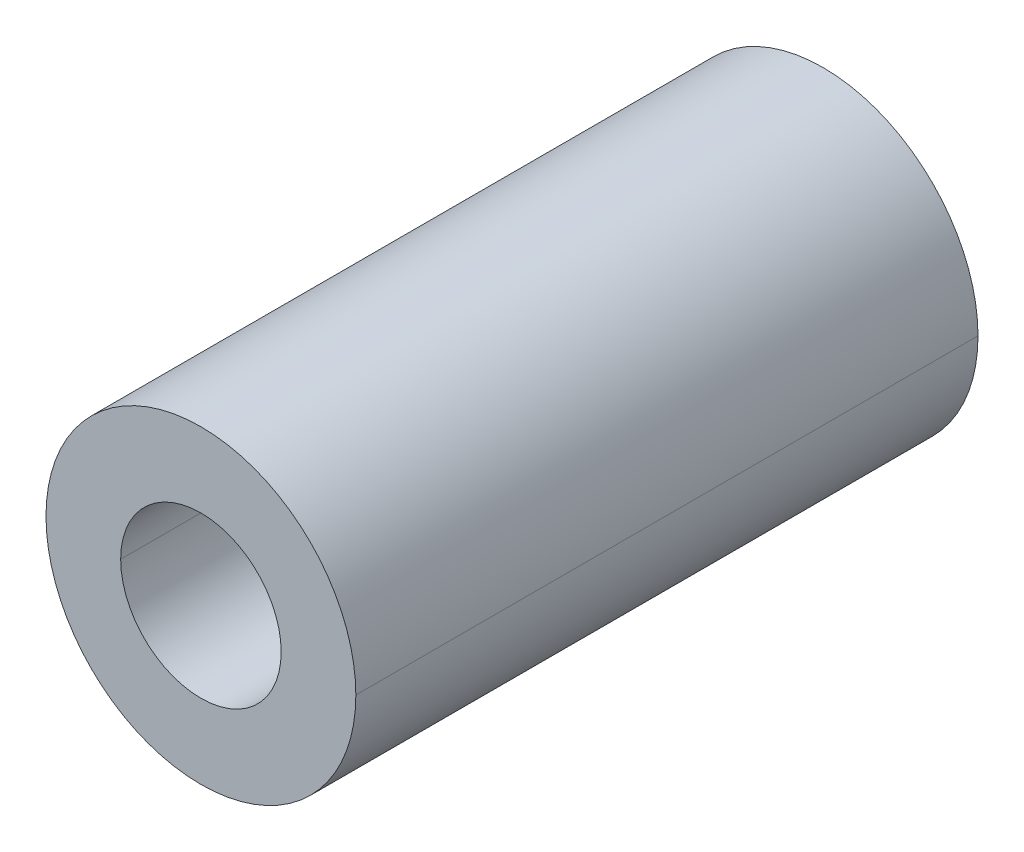
ISO-10303-21;
HEADER;
FILE_DESCRIPTION(('STEP AP214'),'2;1');
FILE_NAME('part.step','',(''),(''),'','','');
FILE_SCHEMA(('AUTOMOTIVE_DESIGN { 1 0 10303 214 1 1 1 1 }'));
ENDSEC;
DATA;
#1=APPLICATION_CONTEXT('core data for automotive mechanical design processes');
#2=APPLICATION_PROTOCOL_DEFINITION('international standard','automotive_design',2000,#1);
#3=PRODUCT_CONTEXT('',#1,'mechanical');
#4=PRODUCT('Part','Part','',(#3));
#5=PRODUCT_RELATED_PRODUCT_CATEGORY('part','',(#4));
#6=PRODUCT_DEFINITION_FORMATION('','',#4);
#7=PRODUCT_DEFINITION_CONTEXT('part definition',#1,'design');
#8=PRODUCT_DEFINITION('design','',#6,#7);
#9=PRODUCT_DEFINITION_SHAPE('','',#8);
#10=(LENGTH_UNIT() NAMED_UNIT(*) SI_UNIT(.MILLI.,.METRE.));
#11=(NAMED_UNIT(*) PLANE_ANGLE_UNIT() SI_UNIT($,.RADIAN.));
#12=(NAMED_UNIT(*) SI_UNIT($,.STERADIAN.) SOLID_ANGLE_UNIT());
#13=UNCERTAINTY_MEASURE_WITH_UNIT(LENGTH_MEASURE(1.E-05),#10,'distance_accuracy_value','');
#14=(GEOMETRIC_REPRESENTATION_CONTEXT(3) GLOBAL_UNCERTAINTY_ASSIGNED_CONTEXT((#13)) GLOBAL_UNIT_ASSIGNED_CONTEXT((#10,
#11,#12)) REPRESENTATION_CONTEXT('',''));
#15=CARTESIAN_POINT('',(0.,0.,0.));
#16=DIRECTION('',(0.,0.,1.));
#17=DIRECTION('',(1.,0.,0.));
#18=AXIS2_PLACEMENT_3D('',#15,#16,#17);
#19=CARTESIAN_POINT('',(0.,0.,228.6));
#20=DIRECTION('',(0.,0.,-1.));
#21=DIRECTION('',(-1.,0.,0.));
#22=AXIS2_PLACEMENT_3D('',#19,#20,#21);
#23=CYLINDRICAL_SURFACE('',#22,3.2766);
#24=CARTESIAN_POINT('',(0.,0.,-203.2));
#25=DIRECTION('',(0.,0.,1.));
#26=DIRECTION('',(1.,0.,0.));
#27=AXIS2_PLACEMENT_3D('',#24,#25,#26);
#28=CIRCLE('',#27,3.2766);
#29=CARTESIAN_POINT('',(3.2766,0.,-203.2));
#30=VERTEX_POINT('',#29);
#31=CARTESIAN_POINT('',(-3.2766,0.,-203.2));
#32=VERTEX_POINT('',#31);
#33=EDGE_CURVE('E66',#30,#32,#28,.F.);
#34=ORIENTED_EDGE('',*,*,#33,.F.);
#35=DIRECTION('',(0.,0.,-1.));
#36=VECTOR('',#35,1.);
#37=CARTESIAN_POINT('',(3.2766,0.,228.6));
#38=LINE('',#37,#36);
#39=CARTESIAN_POINT('',(3.2766,0.,-228.6));
#40=VERTEX_POINT('',#39);
#41=EDGE_CURVE('E54',#30,#40,#38,.T.);
#42=ORIENTED_EDGE('',*,*,#41,.T.);
#43=CARTESIAN_POINT('',(0.,0.,-228.6));
#44=DIRECTION('',(0.,0.,1.));
#45=DIRECTION('',(1.,0.,0.));
#46=AXIS2_PLACEMENT_3D('',#43,#44,#45);
#47=CIRCLE('',#46,3.2766);
#48=CARTESIAN_POINT('',(-3.2766,0.,-228.6));
#49=VERTEX_POINT('',#48);
#50=EDGE_CURVE('E111',#49,#40,#47,.T.);
#51=ORIENTED_EDGE('',*,*,#50,.F.);
#52=DIRECTION('',(0.,0.,-1.));
#53=VECTOR('',#52,1.);
#54=CARTESIAN_POINT('',(-3.2766,0.,228.6));
#55=LINE('',#54,#53);
#56=EDGE_CURVE('E94',#32,#49,#55,.T.);
#57=ORIENTED_EDGE('',*,*,#56,.F.);
#58=EDGE_LOOP('',(#34,#42,#51,#57));
#59=FACE_BOUND('',#58,.T.);
#60=ADVANCED_FACE('F46',(#59),#23,.F.);
#61=CARTESIAN_POINT('',(0.,0.,228.6));
#62=DIRECTION('',(0.,0.,-1.));
#63=DIRECTION('',(-1.,0.,0.));
#64=AXIS2_PLACEMENT_3D('',#61,#62,#63);
#65=CYLINDRICAL_SURFACE('',#64,6.3246);
#66=DIRECTION('',(0.,0.,-1.));
#67=VECTOR('',#66,1.);
#68=CARTESIAN_POINT('',(-6.3246,0.,228.6));
#69=LINE('',#68,#67);
#70=CARTESIAN_POINT('',(-6.3246,0.,-203.2));
#71=VERTEX_POINT('',#70);
#72=CARTESIAN_POINT('',(-6.3246,0.,-228.6));
#73=VERTEX_POINT('',#72);
#74=EDGE_CURVE('E106',#71,#73,#69,.T.);
#75=ORIENTED_EDGE('',*,*,#74,.F.);
#76=CARTESIAN_POINT('',(0.,0.,-203.2));
#77=DIRECTION('',(0.,0.,1.));
#78=DIRECTION('',(1.,0.,0.));
#79=AXIS2_PLACEMENT_3D('',#76,#77,#78);
#80=CIRCLE('',#79,6.3246);
#81=CARTESIAN_POINT('',(6.3246,0.,-203.2));
#82=VERTEX_POINT('',#81);
#83=EDGE_CURVE('E60',#71,#82,#80,.F.);
#84=ORIENTED_EDGE('',*,*,#83,.T.);
#85=DIRECTION('',(0.,0.,-1.));
#86=VECTOR('',#85,1.);
#87=CARTESIAN_POINT('',(6.3246,0.,228.6));
#88=LINE('',#87,#86);
#89=CARTESIAN_POINT('',(6.3246,0.,-228.6));
#90=VERTEX_POINT('',#89);
#91=EDGE_CURVE('E100',#82,#90,#88,.T.);
#92=ORIENTED_EDGE('',*,*,#91,.T.);
#93=CARTESIAN_POINT('',(0.,0.,-228.6));
#94=DIRECTION('',(0.,0.,1.));
#95=DIRECTION('',(1.,0.,0.));
#96=AXIS2_PLACEMENT_3D('',#93,#94,#95);
#97=CIRCLE('',#96,6.3246);
#98=EDGE_CURVE('E102',#90,#73,#97,.T.);
#99=ORIENTED_EDGE('',*,*,#98,.T.);
#100=EDGE_LOOP('',(#75,#84,#92,#99));
#101=FACE_BOUND('',#100,.T.);
#102=ADVANCED_FACE('F127',(#101),#65,.T.);
#103=CARTESIAN_POINT('',(0.,0.,228.6));
#104=DIRECTION('',(0.,0.,-1.));
#105=DIRECTION('',(-1.,0.,0.));
#106=AXIS2_PLACEMENT_3D('',#103,#104,#105);
#107=CYLINDRICAL_SURFACE('',#106,6.3246);
#108=ORIENTED_EDGE('',*,*,#91,.F.);
#109=CARTESIAN_POINT('',(0.,0.,-203.2));
#110=DIRECTION('',(0.,0.,1.));
#111=DIRECTION('',(1.,0.,0.));
#112=AXIS2_PLACEMENT_3D('',#109,#110,#111);
#113=CIRCLE('',#112,6.3246);
#114=EDGE_CURVE('E95',#82,#71,#113,.F.);
#115=ORIENTED_EDGE('',*,*,#114,.T.);
#116=ORIENTED_EDGE('',*,*,#74,.T.);
#117=CARTESIAN_POINT('',(0.,0.,-228.6));
#118=DIRECTION('',(0.,0.,1.));
#119=DIRECTION('',(1.,0.,0.));
#120=AXIS2_PLACEMENT_3D('',#117,#118,#119);
#121=CIRCLE('',#120,6.3246);
#122=EDGE_CURVE('E108',#73,#90,#121,.T.);
#123=ORIENTED_EDGE('',*,*,#122,.T.);
#124=EDGE_LOOP('',(#108,#115,#116,#123));
#125=FACE_BOUND('',#124,.T.);
#126=ADVANCED_FACE('F124',(#125),#107,.T.);
#127=CARTESIAN_POINT('',(0.,0.,228.6));
#128=DIRECTION('',(0.,0.,-1.));
#129=DIRECTION('',(-1.,0.,0.));
#130=AXIS2_PLACEMENT_3D('',#127,#128,#129);
#131=CYLINDRICAL_SURFACE('',#130,3.2766);
#132=CARTESIAN_POINT('',(0.,0.,-203.2));
#133=DIRECTION('',(0.,0.,1.));
#134=DIRECTION('',(1.,0.,0.));
#135=AXIS2_PLACEMENT_3D('',#132,#133,#134);
#136=CIRCLE('',#135,3.2766);
#137=EDGE_CURVE('E11',#32,#30,#136,.F.);
#138=ORIENTED_EDGE('',*,*,#137,.F.);
#139=ORIENTED_EDGE('',*,*,#56,.T.);
#140=CARTESIAN_POINT('',(0.,0.,-228.6));
#141=DIRECTION('',(0.,0.,1.));
#142=DIRECTION('',(1.,0.,0.));
#143=AXIS2_PLACEMENT_3D('',#140,#141,#142);
#144=CIRCLE('',#143,3.2766);
#145=EDGE_CURVE('E99',#40,#49,#144,.T.);
#146=ORIENTED_EDGE('',*,*,#145,.F.);
#147=ORIENTED_EDGE('',*,*,#41,.F.);
#148=EDGE_LOOP('',(#138,#139,#146,#147));
#149=FACE_BOUND('',#148,.T.);
#150=ADVANCED_FACE('F48',(#149),#131,.F.);
#151=CARTESIAN_POINT('',(0.,0.,-228.6));
#152=DIRECTION('',(0.,0.,1.));
#153=DIRECTION('',(1.,0.,0.));
#154=AXIS2_PLACEMENT_3D('',#151,#152,#153);
#155=PLANE('',#154);
#156=ORIENTED_EDGE('',*,*,#122,.F.);
#157=ORIENTED_EDGE('',*,*,#98,.F.);
#158=EDGE_LOOP('',(#156,#157));
#159=FACE_BOUND('',#158,.T.);
#160=ORIENTED_EDGE('',*,*,#50,.T.);
#161=ORIENTED_EDGE('',*,*,#145,.T.);
#162=EDGE_LOOP('',(#160,#161));
#163=FACE_BOUND('',#162,.T.);
#164=ADVANCED_FACE('F129',(#159,#163),#155,.F.);
#165=CARTESIAN_POINT('',(0.,0.,-203.2));
#166=DIRECTION('',(0.,0.,1.));
#167=DIRECTION('',(1.,0.,0.));
#168=AXIS2_PLACEMENT_3D('',#165,#166,#167);
#169=PLANE('',#168);
#170=ORIENTED_EDGE('',*,*,#114,.F.);
#171=ORIENTED_EDGE('',*,*,#83,.F.);
#172=EDGE_LOOP('',(#170,#171));
#173=FACE_BOUND('',#172,.T.);
#174=ORIENTED_EDGE('',*,*,#33,.T.);
#175=ORIENTED_EDGE('',*,*,#137,.T.);
#176=EDGE_LOOP('',(#174,#175));
#177=FACE_BOUND('',#176,.T.);
#178=ADVANCED_FACE('F87',(#173,#177),#169,.T.);
#179=CLOSED_SHELL('',(#60,#102,#126,#150,#164,#178));
#180=MANIFOLD_SOLID_BREP('B2',#179);
#181=ADVANCED_BREP_SHAPE_REPRESENTATION('',(#18,#180),#14);
#182=SHAPE_DEFINITION_REPRESENTATION(#9,#181);
ENDSEC;
END-ISO-10303-21;
